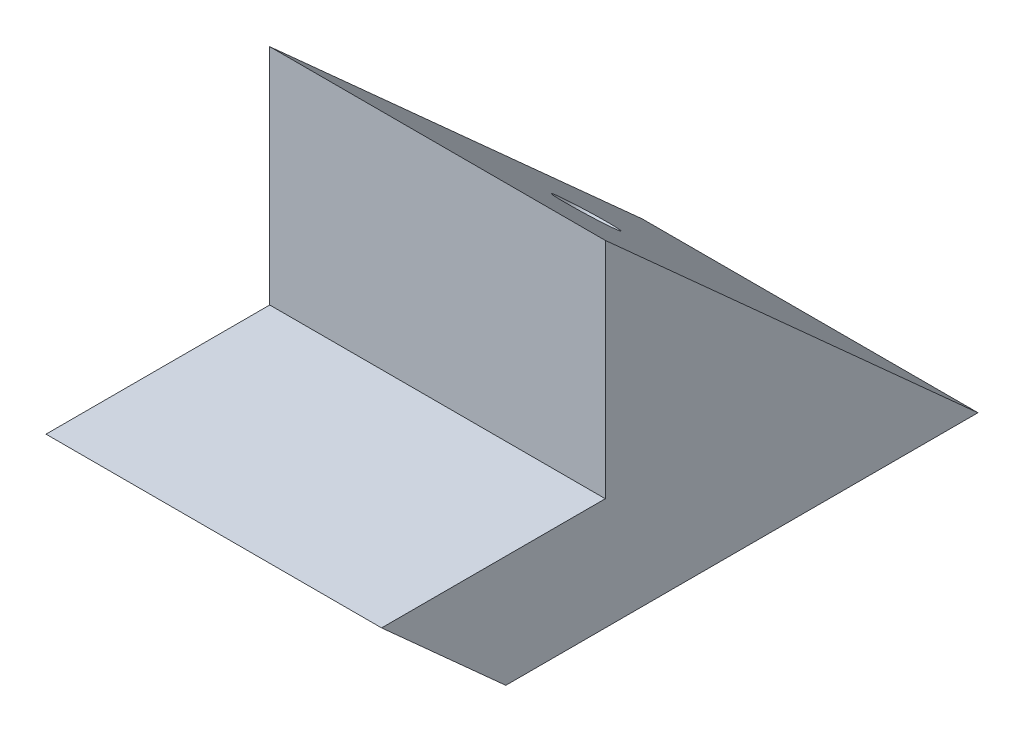
ISO-10303-21;
HEADER;
FILE_DESCRIPTION(('STEP AP214'),'2;1');
FILE_NAME('part.step','',(''),(''),'','','');
FILE_SCHEMA(('AUTOMOTIVE_DESIGN { 1 0 10303 214 1 1 1 1 }'));
ENDSEC;
DATA;
#1=APPLICATION_CONTEXT('core data for automotive mechanical design processes');
#2=APPLICATION_PROTOCOL_DEFINITION('international standard','automotive_design',2000,#1);
#3=PRODUCT_CONTEXT('',#1,'mechanical');
#4=PRODUCT('Part','Part','',(#3));
#5=PRODUCT_RELATED_PRODUCT_CATEGORY('part','',(#4));
#6=PRODUCT_DEFINITION_FORMATION('','',#4);
#7=PRODUCT_DEFINITION_CONTEXT('part definition',#1,'design');
#8=PRODUCT_DEFINITION('design','',#6,#7);
#9=PRODUCT_DEFINITION_SHAPE('','',#8);
#10=(LENGTH_UNIT() NAMED_UNIT(*) SI_UNIT(.MILLI.,.METRE.));
#11=(NAMED_UNIT(*) PLANE_ANGLE_UNIT() SI_UNIT($,.RADIAN.));
#12=(NAMED_UNIT(*) SI_UNIT($,.STERADIAN.) SOLID_ANGLE_UNIT());
#13=UNCERTAINTY_MEASURE_WITH_UNIT(LENGTH_MEASURE(1.E-05),#10,'distance_accuracy_value','');
#14=(GEOMETRIC_REPRESENTATION_CONTEXT(3) GLOBAL_UNCERTAINTY_ASSIGNED_CONTEXT((#13)) GLOBAL_UNIT_ASSIGNED_CONTEXT((#10,
#11,#12)) REPRESENTATION_CONTEXT('',''));
#15=CARTESIAN_POINT('',(0.,0.,0.));
#16=DIRECTION('',(0.,0.,1.));
#17=DIRECTION('',(1.,0.,0.));
#18=AXIS2_PLACEMENT_3D('',#15,#16,#17);
#19=CARTESIAN_POINT('',(30.,-20.,0.));
#20=DIRECTION('',(0.,0.,-1.));
#21=DIRECTION('',(-1.,0.,0.));
#22=AXIS2_PLACEMENT_3D('',#19,#20,#21);
#23=PLANE('',#22);
#24=DIRECTION('',(0.,-1.,0.));
#25=VECTOR('',#24,1.);
#26=CARTESIAN_POINT('',(0.,-20.,0.));
#27=LINE('',#26,#25);
#28=CARTESIAN_POINT('',(0.,0.,0.));
#29=VERTEX_POINT('',#28);
#30=CARTESIAN_POINT('',(0.,-20.,0.));
#31=VERTEX_POINT('',#30);
#32=EDGE_CURVE('E116',#29,#31,#27,.T.);
#33=ORIENTED_EDGE('',*,*,#32,.T.);
#34=DIRECTION('',(-1.,0.,0.));
#35=VECTOR('',#34,1.);
#36=CARTESIAN_POINT('',(30.,-20.,0.));
#37=LINE('',#36,#35);
#38=CARTESIAN_POINT('',(30.,-20.,0.));
#39=VERTEX_POINT('',#38);
#40=EDGE_CURVE('E40',#39,#31,#37,.T.);
#41=ORIENTED_EDGE('',*,*,#40,.F.);
#42=DIRECTION('',(0.,-1.,0.));
#43=VECTOR('',#42,1.);
#44=CARTESIAN_POINT('',(30.,-20.,0.));
#45=LINE('',#44,#43);
#46=CARTESIAN_POINT('',(30.,0.,0.));
#47=VERTEX_POINT('',#46);
#48=EDGE_CURVE('E128',#47,#39,#45,.T.);
#49=ORIENTED_EDGE('',*,*,#48,.F.);
#50=DIRECTION('',(-1.,0.,0.));
#51=VECTOR('',#50,1.);
#52=CARTESIAN_POINT('',(30.,0.,0.));
#53=LINE('',#52,#51);
#54=EDGE_CURVE('E112',#47,#29,#53,.T.);
#55=ORIENTED_EDGE('',*,*,#54,.T.);
#56=EDGE_LOOP('',(#33,#41,#49,#55));
#57=FACE_BOUND('',#56,.T.);
#58=ADVANCED_FACE('F33',(#57),#23,.F.);
#59=CARTESIAN_POINT('',(30.,-20.,20.));
#60=DIRECTION('',(0.,-1.,0.));
#61=DIRECTION('',(0.,0.,-1.));
#62=AXIS2_PLACEMENT_3D('',#59,#60,#61);
#63=PLANE('',#62);
#64=DIRECTION('',(0.,0.,1.));
#65=VECTOR('',#64,1.);
#66=CARTESIAN_POINT('',(0.,-20.,20.));
#67=LINE('',#66,#65);
#68=CARTESIAN_POINT('',(0.,-20.,20.));
#69=VERTEX_POINT('',#68);
#70=EDGE_CURVE('E119',#31,#69,#67,.T.);
#71=ORIENTED_EDGE('',*,*,#70,.T.);
#72=DIRECTION('',(-1.,0.,0.));
#73=VECTOR('',#72,1.);
#74=CARTESIAN_POINT('',(30.,-20.,20.));
#75=LINE('',#74,#73);
#76=CARTESIAN_POINT('',(30.,-20.,20.));
#77=VERTEX_POINT('',#76);
#78=EDGE_CURVE('E106',#77,#69,#75,.T.);
#79=ORIENTED_EDGE('',*,*,#78,.F.);
#80=DIRECTION('',(0.,0.,1.));
#81=VECTOR('',#80,1.);
#82=CARTESIAN_POINT('',(30.,-20.,20.));
#83=LINE('',#82,#81);
#84=EDGE_CURVE('E87',#39,#77,#83,.T.);
#85=ORIENTED_EDGE('',*,*,#84,.F.);
#86=ORIENTED_EDGE('',*,*,#40,.T.);
#87=EDGE_LOOP('',(#71,#79,#85,#86));
#88=FACE_BOUND('',#87,.T.);
#89=ADVANCED_FACE('F149',(#88),#63,.F.);
#90=CARTESIAN_POINT('',(30.,-30.,8.89387485170794));
#91=DIRECTION('',(0.,0.743144825477398,-0.669130606358854));
#92=DIRECTION('',(0.,0.669130606358854,0.743144825477398));
#93=AXIS2_PLACEMENT_3D('',#90,#91,#92);
#94=PLANE('',#93);
#95=DIRECTION('',(-1.,0.,0.));
#96=VECTOR('',#95,1.);
#97=CARTESIAN_POINT('',(30.,-30.,8.89387485170794));
#98=LINE('',#97,#96);
#99=CARTESIAN_POINT('',(14.0694091440192,-30.,8.89387485170794));
#100=VERTEX_POINT('',#99);
#101=CARTESIAN_POINT('',(0.,-30.,8.89387485170794));
#102=VERTEX_POINT('',#101);
#103=EDGE_CURVE('E107',#100,#102,#98,.T.);
#104=ORIENTED_EDGE('',*,*,#103,.F.);
#105=CARTESIAN_POINT('',(15.,-32.9459990544741,5.62201143313398));
#106=DIRECTION('',(0.,0.743144825477398,-0.669130606358854));
#107=DIRECTION('',(0.,0.669130606358854,0.743144825477398));
#108=AXIS2_PLACEMENT_3D('',#105,#106,#107);
#109=CIRCLE('',#108,4.5);
#110=CARTESIAN_POINT('',(15.9305908559808,-30.,8.89387485170794));
#111=VERTEX_POINT('',#110);
#112=EDGE_CURVE('E46',#100,#111,#109,.T.);
#113=ORIENTED_EDGE('',*,*,#112,.T.);
#114=CARTESIAN_POINT('',(30.,-30.,8.89387485170794));
#115=VERTEX_POINT('',#114);
#116=EDGE_CURVE('E102',#115,#111,#98,.T.);
#117=ORIENTED_EDGE('',*,*,#116,.F.);
#118=DIRECTION('',(0.,-0.669130606358854,-0.743144825477398));
#119=VECTOR('',#118,1.);
#120=CARTESIAN_POINT('',(30.,-30.,8.89387485170794));
#121=LINE('',#120,#119);
#122=EDGE_CURVE('E92',#77,#115,#121,.T.);
#123=ORIENTED_EDGE('',*,*,#122,.F.);
#124=ORIENTED_EDGE('',*,*,#78,.T.);
#125=DIRECTION('',(0.,-0.669130606358854,-0.743144825477398));
#126=VECTOR('',#125,1.);
#127=CARTESIAN_POINT('',(0.,-30.,8.89387485170794));
#128=LINE('',#127,#126);
#129=EDGE_CURVE('E122',#69,#102,#128,.T.);
#130=ORIENTED_EDGE('',*,*,#129,.T.);
#131=EDGE_LOOP('',(#104,#113,#117,#123,#124,#130));
#132=FACE_BOUND('',#131,.T.);
#133=ADVANCED_FACE('F104',(#132),#94,.F.);
#134=CARTESIAN_POINT('',(30.,-30.,-33.3183754448762));
#135=DIRECTION('',(0.,1.,0.));
#136=DIRECTION('',(0.,0.,1.));
#137=AXIS2_PLACEMENT_3D('',#134,#135,#136);
#138=PLANE('',#137);
#139=ORIENTED_EDGE('',*,*,#116,.T.);
#140=CARTESIAN_POINT('',(15.,-30.,2.96942196998789));
#141=DIRECTION('',(0.,1.,0.));
#142=DIRECTION('',(0.,0.,-1.));
#143=AXIS2_PLACEMENT_3D('',#140,#141,#142);
#144=ELLIPSE('',#143,6.05534728322866,4.5);
#145=EDGE_CURVE('E11',#111,#100,#144,.T.);
#146=ORIENTED_EDGE('',*,*,#145,.T.);
#147=ORIENTED_EDGE('',*,*,#103,.T.);
#148=DIRECTION('',(0.,0.,-1.));
#149=VECTOR('',#148,1.);
#150=CARTESIAN_POINT('',(0.,-30.,-33.3183754448762));
#151=LINE('',#150,#149);
#152=CARTESIAN_POINT('',(0.,-30.,-33.3183754448762));
#153=VERTEX_POINT('',#152);
#154=EDGE_CURVE('E125',#102,#153,#151,.T.);
#155=ORIENTED_EDGE('',*,*,#154,.T.);
#156=DIRECTION('',(-1.,0.,0.));
#157=VECTOR('',#156,1.);
#158=CARTESIAN_POINT('',(30.,-30.,-33.3183754448762));
#159=LINE('',#158,#157);
#160=CARTESIAN_POINT('',(30.,-30.,-33.3183754448762));
#161=VERTEX_POINT('',#160);
#162=EDGE_CURVE('E110',#161,#153,#159,.T.);
#163=ORIENTED_EDGE('',*,*,#162,.F.);
#164=DIRECTION('',(0.,0.,-1.));
#165=VECTOR('',#164,1.);
#166=CARTESIAN_POINT('',(30.,-30.,-33.3183754448762));
#167=LINE('',#166,#165);
#168=EDGE_CURVE('E96',#115,#161,#167,.T.);
#169=ORIENTED_EDGE('',*,*,#168,.F.);
#170=EDGE_LOOP('',(#139,#146,#147,#155,#163,#169));
#171=FACE_BOUND('',#170,.T.);
#172=ADVANCED_FACE('F109',(#171),#138,.F.);
#173=CARTESIAN_POINT('',(30.,0.,0.));
#174=DIRECTION('',(0.,-0.743144825477398,0.669130606358854));
#175=DIRECTION('',(0.,-0.669130606358854,-0.743144825477398));
#176=AXIS2_PLACEMENT_3D('',#173,#174,#175);
#177=PLANE('',#176);
#178=CARTESIAN_POINT('',(15.,-11.9554954681147,-13.2779228878721));
#179=DIRECTION('',(0.,0.743144825477398,-0.669130606358854));
#180=DIRECTION('',(0.,0.669130606358854,0.743144825477398));
#181=AXIS2_PLACEMENT_3D('',#178,#179,#180);
#182=CIRCLE('',#181,2.5);
#183=CARTESIAN_POINT('',(15.,-10.2826689522176,-11.4200608241786));
#184=VERTEX_POINT('',#183);
#185=EDGE_CURVE('E120',#184,#184,#182,.T.);
#186=ORIENTED_EDGE('',*,*,#185,.F.);
#187=EDGE_LOOP('',(#186));
#188=FACE_BOUND('',#187,.T.);
#189=DIRECTION('',(0.,0.669130606358854,0.743144825477398));
#190=VECTOR('',#189,1.);
#191=CARTESIAN_POINT('',(0.,0.,0.));
#192=LINE('',#191,#190);
#193=EDGE_CURVE('E78',#153,#29,#192,.T.);
#194=ORIENTED_EDGE('',*,*,#193,.T.);
#195=ORIENTED_EDGE('',*,*,#54,.F.);
#196=DIRECTION('',(0.,0.669130606358854,0.743144825477398));
#197=VECTOR('',#196,1.);
#198=CARTESIAN_POINT('',(30.,0.,0.));
#199=LINE('',#198,#197);
#200=EDGE_CURVE('E54',#161,#47,#199,.T.);
#201=ORIENTED_EDGE('',*,*,#200,.F.);
#202=ORIENTED_EDGE('',*,*,#162,.T.);
#203=EDGE_LOOP('',(#194,#195,#201,#202));
#204=FACE_BOUND('',#203,.T.);
#205=ADVANCED_FACE('F154',(#188,#204),#177,.F.);
#206=CARTESIAN_POINT('',(30.,0.,0.));
#207=DIRECTION('',(1.,0.,0.));
#208=DIRECTION('',(0.,0.,-1.));
#209=AXIS2_PLACEMENT_3D('',#206,#207,#208);
#210=PLANE('',#209);
#211=ORIENTED_EDGE('',*,*,#48,.T.);
#212=ORIENTED_EDGE('',*,*,#84,.T.);
#213=ORIENTED_EDGE('',*,*,#122,.T.);
#214=ORIENTED_EDGE('',*,*,#168,.T.);
#215=ORIENTED_EDGE('',*,*,#200,.T.);
#216=EDGE_LOOP('',(#211,#212,#213,#214,#215));
#217=FACE_BOUND('',#216,.T.);
#218=ADVANCED_FACE('F94',(#217),#210,.T.);
#219=CARTESIAN_POINT('',(0.,0.,0.));
#220=DIRECTION('',(1.,0.,0.));
#221=DIRECTION('',(0.,0.,-1.));
#222=AXIS2_PLACEMENT_3D('',#219,#220,#221);
#223=PLANE('',#222);
#224=ORIENTED_EDGE('',*,*,#32,.F.);
#225=ORIENTED_EDGE('',*,*,#193,.F.);
#226=ORIENTED_EDGE('',*,*,#154,.F.);
#227=ORIENTED_EDGE('',*,*,#129,.F.);
#228=ORIENTED_EDGE('',*,*,#70,.F.);
#229=EDGE_LOOP('',(#224,#225,#226,#227,#228));
#230=FACE_BOUND('',#229,.T.);
#231=ADVANCED_FACE('F153',(#230),#223,.F.);
#232=CARTESIAN_POINT('',(15.,-38.4686413708124,10.5946209099753));
#233=DIRECTION('',(0.,0.743144825477398,-0.669130606358854));
#234=DIRECTION('',(0.,0.669130606358854,0.743144825477398));
#235=AXIS2_PLACEMENT_3D('',#232,#233,#234);
#236=CYLINDRICAL_SURFACE('',#235,2.5);
#237=CARTESIAN_POINT('',(15.,-25.3321023267079,-1.23357197341272));
#238=DIRECTION('',(0.,0.743144825477398,-0.669130606358854));
#239=DIRECTION('',(0.,0.669130606358854,0.743144825477398));
#240=AXIS2_PLACEMENT_3D('',#237,#238,#239);
#241=CIRCLE('',#240,2.5);
#242=CARTESIAN_POINT('',(15.,-23.6592758108108,0.624290090280771));
#243=VERTEX_POINT('',#242);
#244=EDGE_CURVE('E132',#243,#243,#241,.F.);
#245=ORIENTED_EDGE('',*,*,#244,.T.);
#246=EDGE_LOOP('',(#245));
#247=FACE_BOUND('',#246,.T.);
#248=ORIENTED_EDGE('',*,*,#185,.T.);
#249=EDGE_LOOP('',(#248));
#250=FACE_BOUND('',#249,.T.);
#251=ADVANCED_FACE('F186',(#247,#250),#236,.F.);
#252=CARTESIAN_POINT('',(15.,-38.4686413708124,10.5946209099753));
#253=DIRECTION('',(0.,0.743144825477398,-0.669130606358854));
#254=DIRECTION('',(0.,0.669130606358854,0.743144825477398));
#255=AXIS2_PLACEMENT_3D('',#252,#253,#254);
#256=CYLINDRICAL_SURFACE('',#255,4.5);
#257=CARTESIAN_POINT('',(15.,-25.3321023267079,-1.23357197341273));
#258=DIRECTION('',(0.,0.743144825477398,-0.669130606358854));
#259=DIRECTION('',(0.,0.669130606358854,0.743144825477398));
#260=AXIS2_PLACEMENT_3D('',#257,#258,#259);
#261=CIRCLE('',#260,4.5);
#262=CARTESIAN_POINT('',(15.,-22.3210145980931,2.11057974123556));
#263=VERTEX_POINT('',#262);
#264=EDGE_CURVE('E134',#263,#263,#261,.T.);
#265=ORIENTED_EDGE('',*,*,#264,.T.);
#266=EDGE_LOOP('',(#265));
#267=FACE_BOUND('',#266,.T.);
#268=ORIENTED_EDGE('',*,*,#145,.F.);
#269=ORIENTED_EDGE('',*,*,#112,.F.);
#270=EDGE_LOOP('',(#268,#269));
#271=FACE_BOUND('',#270,.T.);
#272=ADVANCED_FACE('F191',(#267,#271),#256,.F.);
#273=CARTESIAN_POINT('',(15.,-25.3321023267079,-1.23357197341273));
#274=DIRECTION('',(0.,0.743144825477398,-0.669130606358854));
#275=DIRECTION('',(0.,0.669130606358854,0.743144825477398));
#276=AXIS2_PLACEMENT_3D('',#273,#274,#275);
#277=PLANE('',#276);
#278=ORIENTED_EDGE('',*,*,#264,.F.);
#279=EDGE_LOOP('',(#278));
#280=FACE_BOUND('',#279,.T.);
#281=ORIENTED_EDGE('',*,*,#244,.F.);
#282=EDGE_LOOP('',(#281));
#283=FACE_BOUND('',#282,.T.);
#284=ADVANCED_FACE('F202',(#280,#283),#277,.F.);
#285=CLOSED_SHELL('',(#58,#89,#133,#172,#205,#218,#231,#251,#272,#284));
#286=MANIFOLD_SOLID_BREP('B2',#285);
#287=ADVANCED_BREP_SHAPE_REPRESENTATION('',(#18,#286),#14);
#288=SHAPE_DEFINITION_REPRESENTATION(#9,#287);
ENDSEC;
END-ISO-10303-21;
